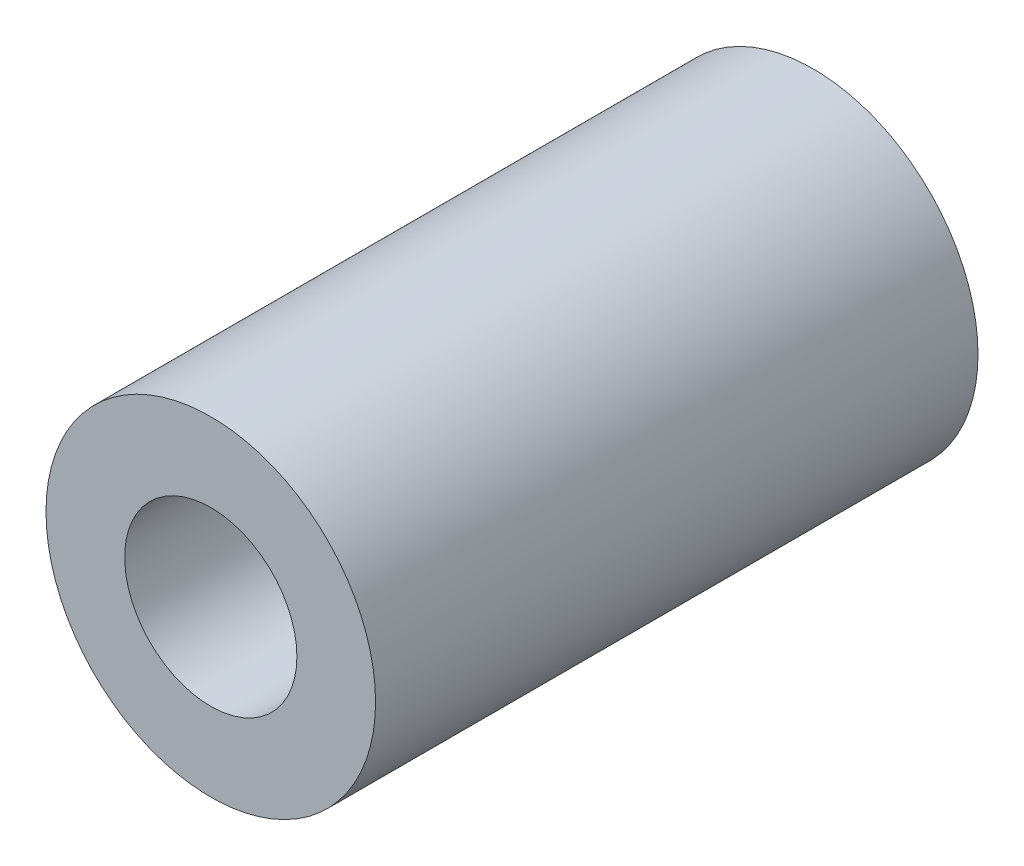
ISO-10303-21;
HEADER;
FILE_DESCRIPTION(('STEP AP214'),'2;1');
FILE_NAME('part.step','',(''),(''),'','','');
FILE_SCHEMA(('AUTOMOTIVE_DESIGN { 1 0 10303 214 1 1 1 1 }'));
ENDSEC;
DATA;
#1=APPLICATION_CONTEXT('core data for automotive mechanical design processes');
#2=APPLICATION_PROTOCOL_DEFINITION('international standard','automotive_design',2000,#1);
#3=PRODUCT_CONTEXT('',#1,'mechanical');
#4=PRODUCT('Part','Part','',(#3));
#5=PRODUCT_RELATED_PRODUCT_CATEGORY('part','',(#4));
#6=PRODUCT_DEFINITION_FORMATION('','',#4);
#7=PRODUCT_DEFINITION_CONTEXT('part definition',#1,'design');
#8=PRODUCT_DEFINITION('design','',#6,#7);
#9=PRODUCT_DEFINITION_SHAPE('','',#8);
#10=(LENGTH_UNIT() NAMED_UNIT(*) SI_UNIT(.MILLI.,.METRE.));
#11=(NAMED_UNIT(*) PLANE_ANGLE_UNIT() SI_UNIT($,.RADIAN.));
#12=(NAMED_UNIT(*) SI_UNIT($,.STERADIAN.) SOLID_ANGLE_UNIT());
#13=UNCERTAINTY_MEASURE_WITH_UNIT(LENGTH_MEASURE(1.E-05),#10,'distance_accuracy_value','');
#14=(GEOMETRIC_REPRESENTATION_CONTEXT(3) GLOBAL_UNCERTAINTY_ASSIGNED_CONTEXT((#13)) GLOBAL_UNIT_ASSIGNED_CONTEXT((#10,
#11,#12)) REPRESENTATION_CONTEXT('',''));
#15=CARTESIAN_POINT('',(0.,0.,0.));
#16=DIRECTION('',(0.,0.,1.));
#17=DIRECTION('',(1.,0.,0.));
#18=AXIS2_PLACEMENT_3D('',#15,#16,#17);
#19=CARTESIAN_POINT('',(0.,0.,8.70585));
#20=DIRECTION('',(0.,0.,1.));
#21=DIRECTION('',(1.,0.,0.));
#22=AXIS2_PLACEMENT_3D('',#19,#20,#21);
#23=PLANE('',#22);
#24=CARTESIAN_POINT('',(0.,0.,8.70585));
#25=DIRECTION('',(0.,0.,1.));
#26=DIRECTION('',(1.,0.,0.));
#27=AXIS2_PLACEMENT_3D('',#24,#25,#26);
#28=CIRCLE('',#27,4.7625);
#29=CARTESIAN_POINT('',(4.7625,0.,8.70585));
#30=VERTEX_POINT('',#29);
#31=EDGE_CURVE('E10',#30,#30,#28,.T.);
#32=ORIENTED_EDGE('',*,*,#31,.T.);
#33=EDGE_LOOP('',(#32));
#34=FACE_BOUND('',#33,.T.);
#35=CARTESIAN_POINT('',(0.,0.,8.70585));
#36=DIRECTION('',(0.,0.,1.));
#37=DIRECTION('',(1.,0.,0.));
#38=AXIS2_PLACEMENT_3D('',#35,#36,#37);
#39=CIRCLE('',#38,2.4892);
#40=CARTESIAN_POINT('',(2.4892,0.,8.70585));
#41=VERTEX_POINT('',#40);
#42=EDGE_CURVE('E56',#41,#41,#39,.T.);
#43=ORIENTED_EDGE('',*,*,#42,.F.);
#44=EDGE_LOOP('',(#43));
#45=FACE_BOUND('',#44,.T.);
#46=ADVANCED_FACE('F43',(#34,#45),#23,.T.);
#47=CARTESIAN_POINT('',(0.,0.,-8.70585));
#48=DIRECTION('',(0.,0.,1.));
#49=DIRECTION('',(1.,0.,0.));
#50=AXIS2_PLACEMENT_3D('',#47,#48,#49);
#51=PLANE('',#50);
#52=CARTESIAN_POINT('',(0.,0.,-8.70585));
#53=DIRECTION('',(0.,0.,1.));
#54=DIRECTION('',(1.,0.,0.));
#55=AXIS2_PLACEMENT_3D('',#52,#53,#54);
#56=CIRCLE('',#55,4.7625);
#57=CARTESIAN_POINT('',(4.7625,0.,-8.70585));
#58=VERTEX_POINT('',#57);
#59=EDGE_CURVE('E47',#58,#58,#56,.T.);
#60=ORIENTED_EDGE('',*,*,#59,.F.);
#61=EDGE_LOOP('',(#60));
#62=FACE_BOUND('',#61,.T.);
#63=CARTESIAN_POINT('',(0.,0.,-8.70585));
#64=DIRECTION('',(0.,0.,1.));
#65=DIRECTION('',(1.,0.,0.));
#66=AXIS2_PLACEMENT_3D('',#63,#64,#65);
#67=CIRCLE('',#66,2.4892);
#68=CARTESIAN_POINT('',(2.4892,0.,-8.70585));
#69=VERTEX_POINT('',#68);
#70=EDGE_CURVE('E58',#69,#69,#67,.T.);
#71=ORIENTED_EDGE('',*,*,#70,.T.);
#72=EDGE_LOOP('',(#71));
#73=FACE_BOUND('',#72,.T.);
#74=ADVANCED_FACE('F70',(#62,#73),#51,.F.);
#75=CARTESIAN_POINT('',(0.,0.,8.70585));
#76=DIRECTION('',(0.,0.,-1.));
#77=DIRECTION('',(-1.,0.,0.));
#78=AXIS2_PLACEMENT_3D('',#75,#76,#77);
#79=CYLINDRICAL_SURFACE('',#78,4.7625);
#80=ORIENTED_EDGE('',*,*,#31,.F.);
#81=EDGE_LOOP('',(#80));
#82=FACE_BOUND('',#81,.T.);
#83=ORIENTED_EDGE('',*,*,#59,.T.);
#84=EDGE_LOOP('',(#83));
#85=FACE_BOUND('',#84,.T.);
#86=ADVANCED_FACE('F45',(#82,#85),#79,.T.);
#87=CARTESIAN_POINT('',(0.,0.,8.70585));
#88=DIRECTION('',(0.,0.,-1.));
#89=DIRECTION('',(-1.,0.,0.));
#90=AXIS2_PLACEMENT_3D('',#87,#88,#89);
#91=CYLINDRICAL_SURFACE('',#90,2.4892);
#92=ORIENTED_EDGE('',*,*,#42,.T.);
#93=EDGE_LOOP('',(#92));
#94=FACE_BOUND('',#93,.T.);
#95=ORIENTED_EDGE('',*,*,#70,.F.);
#96=EDGE_LOOP('',(#95));
#97=FACE_BOUND('',#96,.T.);
#98=ADVANCED_FACE('F66',(#94,#97),#91,.F.);
#99=CLOSED_SHELL('',(#46,#74,#86,#98));
#100=MANIFOLD_SOLID_BREP('B2',#99);
#101=ADVANCED_BREP_SHAPE_REPRESENTATION('',(#18,#100),#14);
#102=SHAPE_DEFINITION_REPRESENTATION(#9,#101);
ENDSEC;
END-ISO-10303-21;
